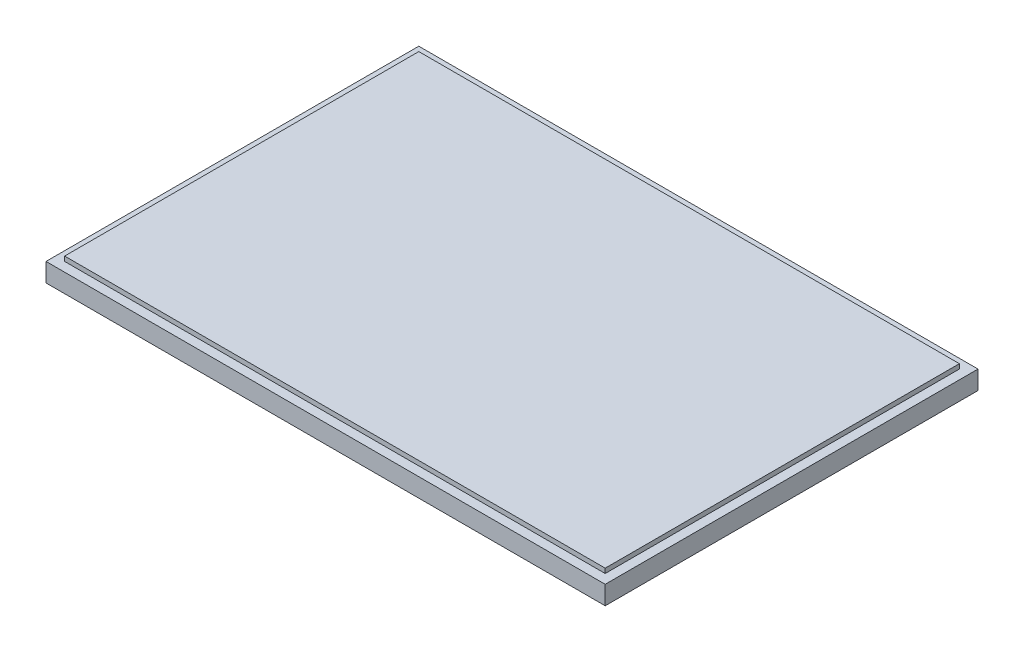
ISO-10303-21;
HEADER;
FILE_DESCRIPTION(('STEP AP214'),'2;1');
FILE_NAME('part.step','',(''),(''),'','','');
FILE_SCHEMA(('AUTOMOTIVE_DESIGN { 1 0 10303 214 1 1 1 1 }'));
ENDSEC;
DATA;
#1=APPLICATION_CONTEXT('core data for automotive mechanical design processes');
#2=APPLICATION_PROTOCOL_DEFINITION('international standard','automotive_design',2000,#1);
#3=PRODUCT_CONTEXT('',#1,'mechanical');
#4=PRODUCT('Part','Part','',(#3));
#5=PRODUCT_RELATED_PRODUCT_CATEGORY('part','',(#4));
#6=PRODUCT_DEFINITION_FORMATION('','',#4);
#7=PRODUCT_DEFINITION_CONTEXT('part definition',#1,'design');
#8=PRODUCT_DEFINITION('design','',#6,#7);
#9=PRODUCT_DEFINITION_SHAPE('','',#8);
#10=(LENGTH_UNIT() NAMED_UNIT(*) SI_UNIT(.MILLI.,.METRE.));
#11=(NAMED_UNIT(*) PLANE_ANGLE_UNIT() SI_UNIT($,.RADIAN.));
#12=(NAMED_UNIT(*) SI_UNIT($,.STERADIAN.) SOLID_ANGLE_UNIT());
#13=UNCERTAINTY_MEASURE_WITH_UNIT(LENGTH_MEASURE(1.E-05),#10,'distance_accuracy_value','');
#14=(GEOMETRIC_REPRESENTATION_CONTEXT(3) GLOBAL_UNCERTAINTY_ASSIGNED_CONTEXT((#13)) GLOBAL_UNIT_ASSIGNED_CONTEXT((#10,
#11,#12)) REPRESENTATION_CONTEXT('',''));
#15=CARTESIAN_POINT('',(0.,0.,0.));
#16=DIRECTION('',(0.,0.,1.));
#17=DIRECTION('',(1.,0.,0.));
#18=AXIS2_PLACEMENT_3D('',#15,#16,#17);
#19=CARTESIAN_POINT('',(30.,2.,-20.));
#20=DIRECTION('',(-1.,0.,0.));
#21=DIRECTION('',(0.,0.,1.));
#22=AXIS2_PLACEMENT_3D('',#19,#20,#21);
#23=PLANE('',#22);
#24=DIRECTION('',(0.,0.,-1.));
#25=VECTOR('',#24,1.);
#26=CARTESIAN_POINT('',(30.,0.,-20.));
#27=LINE('',#26,#25);
#28=CARTESIAN_POINT('',(30.,0.,20.));
#29=VERTEX_POINT('',#28);
#30=CARTESIAN_POINT('',(30.,0.,-20.));
#31=VERTEX_POINT('',#30);
#32=EDGE_CURVE('E133',#29,#31,#27,.T.);
#33=ORIENTED_EDGE('',*,*,#32,.T.);
#34=DIRECTION('',(0.,-1.,0.));
#35=VECTOR('',#34,1.);
#36=CARTESIAN_POINT('',(30.,2.,-20.));
#37=LINE('',#36,#35);
#38=CARTESIAN_POINT('',(30.,2.,-20.));
#39=VERTEX_POINT('',#38);
#40=EDGE_CURVE('E11',#39,#31,#37,.T.);
#41=ORIENTED_EDGE('',*,*,#40,.F.);
#42=DIRECTION('',(0.,0.,-1.));
#43=VECTOR('',#42,1.);
#44=CARTESIAN_POINT('',(30.,2.,-20.));
#45=LINE('',#44,#43);
#46=CARTESIAN_POINT('',(30.,2.,20.));
#47=VERTEX_POINT('',#46);
#48=EDGE_CURVE('E144',#47,#39,#45,.T.);
#49=ORIENTED_EDGE('',*,*,#48,.F.);
#50=DIRECTION('',(0.,-1.,0.));
#51=VECTOR('',#50,1.);
#52=CARTESIAN_POINT('',(30.,2.,20.));
#53=LINE('',#52,#51);
#54=EDGE_CURVE('E157',#47,#29,#53,.T.);
#55=ORIENTED_EDGE('',*,*,#54,.T.);
#56=EDGE_LOOP('',(#33,#41,#49,#55));
#57=FACE_BOUND('',#56,.T.);
#58=ADVANCED_FACE('F45',(#57),#23,.F.);
#59=CARTESIAN_POINT('',(-30.,2.,-20.));
#60=DIRECTION('',(0.,0.,1.));
#61=DIRECTION('',(1.,0.,0.));
#62=AXIS2_PLACEMENT_3D('',#59,#60,#61);
#63=PLANE('',#62);
#64=DIRECTION('',(-1.,0.,0.));
#65=VECTOR('',#64,1.);
#66=CARTESIAN_POINT('',(-30.,0.,-20.));
#67=LINE('',#66,#65);
#68=CARTESIAN_POINT('',(-30.,0.,-20.));
#69=VERTEX_POINT('',#68);
#70=EDGE_CURVE('E138',#31,#69,#67,.T.);
#71=ORIENTED_EDGE('',*,*,#70,.T.);
#72=DIRECTION('',(0.,-1.,0.));
#73=VECTOR('',#72,1.);
#74=CARTESIAN_POINT('',(-30.,2.,-20.));
#75=LINE('',#74,#73);
#76=CARTESIAN_POINT('',(-30.,2.,-20.));
#77=VERTEX_POINT('',#76);
#78=EDGE_CURVE('E53',#77,#69,#75,.T.);
#79=ORIENTED_EDGE('',*,*,#78,.F.);
#80=DIRECTION('',(-1.,0.,0.));
#81=VECTOR('',#80,1.);
#82=CARTESIAN_POINT('',(-30.,2.,-20.));
#83=LINE('',#82,#81);
#84=EDGE_CURVE('E148',#39,#77,#83,.T.);
#85=ORIENTED_EDGE('',*,*,#84,.F.);
#86=ORIENTED_EDGE('',*,*,#40,.T.);
#87=EDGE_LOOP('',(#71,#79,#85,#86));
#88=FACE_BOUND('',#87,.T.);
#89=ADVANCED_FACE('F194',(#88),#63,.F.);
#90=CARTESIAN_POINT('',(-30.,2.,-20.));
#91=DIRECTION('',(1.,0.,0.));
#92=DIRECTION('',(0.,0.,-1.));
#93=AXIS2_PLACEMENT_3D('',#90,#91,#92);
#94=PLANE('',#93);
#95=DIRECTION('',(0.,0.,1.));
#96=VECTOR('',#95,1.);
#97=CARTESIAN_POINT('',(-30.,0.,-20.));
#98=LINE('',#97,#96);
#99=CARTESIAN_POINT('',(-30.,0.,20.));
#100=VERTEX_POINT('',#99);
#101=EDGE_CURVE('E161',#69,#100,#98,.T.);
#102=ORIENTED_EDGE('',*,*,#101,.T.);
#103=DIRECTION('',(0.,-1.,0.));
#104=VECTOR('',#103,1.);
#105=CARTESIAN_POINT('',(-30.,2.,20.));
#106=LINE('',#105,#104);
#107=CARTESIAN_POINT('',(-30.,2.,20.));
#108=VERTEX_POINT('',#107);
#109=EDGE_CURVE('E169',#108,#100,#106,.T.);
#110=ORIENTED_EDGE('',*,*,#109,.F.);
#111=DIRECTION('',(0.,0.,1.));
#112=VECTOR('',#111,1.);
#113=CARTESIAN_POINT('',(-30.,2.,-20.));
#114=LINE('',#113,#112);
#115=EDGE_CURVE('E152',#77,#108,#114,.T.);
#116=ORIENTED_EDGE('',*,*,#115,.F.);
#117=ORIENTED_EDGE('',*,*,#78,.T.);
#118=EDGE_LOOP('',(#102,#110,#116,#117));
#119=FACE_BOUND('',#118,.T.);
#120=ADVANCED_FACE('F178',(#119),#94,.F.);
#121=CARTESIAN_POINT('',(-30.,2.,20.));
#122=DIRECTION('',(0.,0.,-1.));
#123=DIRECTION('',(-1.,0.,0.));
#124=AXIS2_PLACEMENT_3D('',#121,#122,#123);
#125=PLANE('',#124);
#126=DIRECTION('',(1.,0.,0.));
#127=VECTOR('',#126,1.);
#128=CARTESIAN_POINT('',(-30.,0.,20.));
#129=LINE('',#128,#127);
#130=EDGE_CURVE('E149',#100,#29,#129,.T.);
#131=ORIENTED_EDGE('',*,*,#130,.T.);
#132=ORIENTED_EDGE('',*,*,#54,.F.);
#133=DIRECTION('',(1.,0.,0.));
#134=VECTOR('',#133,1.);
#135=CARTESIAN_POINT('',(-30.,2.,20.));
#136=LINE('',#135,#134);
#137=EDGE_CURVE('E155',#108,#47,#136,.T.);
#138=ORIENTED_EDGE('',*,*,#137,.F.);
#139=ORIENTED_EDGE('',*,*,#109,.T.);
#140=EDGE_LOOP('',(#131,#132,#138,#139));
#141=FACE_BOUND('',#140,.T.);
#142=ADVANCED_FACE('F187',(#141),#125,.F.);
#143=CARTESIAN_POINT('',(0.,2.,0.));
#144=DIRECTION('',(0.,1.,0.));
#145=DIRECTION('',(0.,0.,1.));
#146=AXIS2_PLACEMENT_3D('',#143,#144,#145);
#147=PLANE('',#146);
#148=DIRECTION('',(0.,0.,-1.));
#149=VECTOR('',#148,1.);
#150=CARTESIAN_POINT('',(29.,2.,-19.));
#151=LINE('',#150,#149);
#152=CARTESIAN_POINT('',(29.,2.,19.));
#153=VERTEX_POINT('',#152);
#154=CARTESIAN_POINT('',(29.,2.,-19.));
#155=VERTEX_POINT('',#154);
#156=EDGE_CURVE('E60',#153,#155,#151,.T.);
#157=ORIENTED_EDGE('',*,*,#156,.F.);
#158=DIRECTION('',(1.,0.,0.));
#159=VECTOR('',#158,1.);
#160=CARTESIAN_POINT('',(-29.,2.,19.));
#161=LINE('',#160,#159);
#162=CARTESIAN_POINT('',(-29.,2.,19.));
#163=VERTEX_POINT('',#162);
#164=EDGE_CURVE('E64',#163,#153,#161,.T.);
#165=ORIENTED_EDGE('',*,*,#164,.F.);
#166=DIRECTION('',(0.,0.,1.));
#167=VECTOR('',#166,1.);
#168=CARTESIAN_POINT('',(-29.,2.,-19.));
#169=LINE('',#168,#167);
#170=CARTESIAN_POINT('',(-29.,2.,-19.));
#171=VERTEX_POINT('',#170);
#172=EDGE_CURVE('E289',#171,#163,#169,.T.);
#173=ORIENTED_EDGE('',*,*,#172,.F.);
#174=DIRECTION('',(-1.,0.,0.));
#175=VECTOR('',#174,1.);
#176=CARTESIAN_POINT('',(-29.,2.,-19.));
#177=LINE('',#176,#175);
#178=EDGE_CURVE('E299',#155,#171,#177,.T.);
#179=ORIENTED_EDGE('',*,*,#178,.F.);
#180=EDGE_LOOP('',(#157,#165,#173,#179));
#181=FACE_BOUND('',#180,.T.);
#182=ORIENTED_EDGE('',*,*,#48,.T.);
#183=ORIENTED_EDGE('',*,*,#84,.T.);
#184=ORIENTED_EDGE('',*,*,#115,.T.);
#185=ORIENTED_EDGE('',*,*,#137,.T.);
#186=EDGE_LOOP('',(#182,#183,#184,#185));
#187=FACE_BOUND('',#186,.T.);
#188=ADVANCED_FACE('F193',(#181,#187),#147,.T.);
#189=CARTESIAN_POINT('',(0.,0.,0.));
#190=DIRECTION('',(0.,1.,0.));
#191=DIRECTION('',(0.,0.,1.));
#192=AXIS2_PLACEMENT_3D('',#189,#190,#191);
#193=PLANE('',#192);
#194=ORIENTED_EDGE('',*,*,#32,.F.);
#195=ORIENTED_EDGE('',*,*,#130,.F.);
#196=ORIENTED_EDGE('',*,*,#101,.F.);
#197=ORIENTED_EDGE('',*,*,#70,.F.);
#198=EDGE_LOOP('',(#194,#195,#196,#197));
#199=FACE_BOUND('',#198,.T.);
#200=ADVANCED_FACE('F184',(#199),#193,.F.);
#201=CARTESIAN_POINT('',(29.,2.5,-19.));
#202=DIRECTION('',(-1.,0.,0.));
#203=DIRECTION('',(0.,0.,1.));
#204=AXIS2_PLACEMENT_3D('',#201,#202,#203);
#205=PLANE('',#204);
#206=ORIENTED_EDGE('',*,*,#156,.T.);
#207=DIRECTION('',(0.,-1.,0.));
#208=VECTOR('',#207,1.);
#209=CARTESIAN_POINT('',(29.,2.5,-19.));
#210=LINE('',#209,#208);
#211=CARTESIAN_POINT('',(29.,2.5,-19.));
#212=VERTEX_POINT('',#211);
#213=EDGE_CURVE('E113',#212,#155,#210,.T.);
#214=ORIENTED_EDGE('',*,*,#213,.F.);
#215=DIRECTION('',(0.,0.,-1.));
#216=VECTOR('',#215,1.);
#217=CARTESIAN_POINT('',(29.,2.5,-19.));
#218=LINE('',#217,#216);
#219=CARTESIAN_POINT('',(29.,2.5,19.));
#220=VERTEX_POINT('',#219);
#221=EDGE_CURVE('E120',#220,#212,#218,.T.);
#222=ORIENTED_EDGE('',*,*,#221,.F.);
#223=DIRECTION('',(0.,-1.,0.));
#224=VECTOR('',#223,1.);
#225=CARTESIAN_POINT('',(29.,2.5,19.));
#226=LINE('',#225,#224);
#227=EDGE_CURVE('E286',#220,#153,#226,.T.);
#228=ORIENTED_EDGE('',*,*,#227,.T.);
#229=EDGE_LOOP('',(#206,#214,#222,#228));
#230=FACE_BOUND('',#229,.T.);
#231=ADVANCED_FACE('F131',(#230),#205,.F.);
#232=CARTESIAN_POINT('',(-29.,2.5,-19.));
#233=DIRECTION('',(0.,0.,1.));
#234=DIRECTION('',(1.,0.,0.));
#235=AXIS2_PLACEMENT_3D('',#232,#233,#234);
#236=PLANE('',#235);
#237=ORIENTED_EDGE('',*,*,#178,.T.);
#238=DIRECTION('',(0.,-1.,0.));
#239=VECTOR('',#238,1.);
#240=CARTESIAN_POINT('',(-29.,2.5,-19.));
#241=LINE('',#240,#239);
#242=CARTESIAN_POINT('',(-29.,2.5,-19.));
#243=VERTEX_POINT('',#242);
#244=EDGE_CURVE('E115',#243,#171,#241,.T.);
#245=ORIENTED_EDGE('',*,*,#244,.F.);
#246=DIRECTION('',(-1.,0.,0.));
#247=VECTOR('',#246,1.);
#248=CARTESIAN_POINT('',(-29.,2.5,-19.));
#249=LINE('',#248,#247);
#250=EDGE_CURVE('E108',#212,#243,#249,.T.);
#251=ORIENTED_EDGE('',*,*,#250,.F.);
#252=ORIENTED_EDGE('',*,*,#213,.T.);
#253=EDGE_LOOP('',(#237,#245,#251,#252));
#254=FACE_BOUND('',#253,.T.);
#255=ADVANCED_FACE('F111',(#254),#236,.F.);
#256=CARTESIAN_POINT('',(-29.,2.5,-19.));
#257=DIRECTION('',(1.,0.,0.));
#258=DIRECTION('',(0.,0.,-1.));
#259=AXIS2_PLACEMENT_3D('',#256,#257,#258);
#260=PLANE('',#259);
#261=ORIENTED_EDGE('',*,*,#172,.T.);
#262=DIRECTION('',(0.,-1.,0.));
#263=VECTOR('',#262,1.);
#264=CARTESIAN_POINT('',(-29.,2.5,19.));
#265=LINE('',#264,#263);
#266=CARTESIAN_POINT('',(-29.,2.5,19.));
#267=VERTEX_POINT('',#266);
#268=EDGE_CURVE('E140',#267,#163,#265,.T.);
#269=ORIENTED_EDGE('',*,*,#268,.F.);
#270=DIRECTION('',(0.,0.,1.));
#271=VECTOR('',#270,1.);
#272=CARTESIAN_POINT('',(-29.,2.5,-19.));
#273=LINE('',#272,#271);
#274=EDGE_CURVE('E119',#243,#267,#273,.T.);
#275=ORIENTED_EDGE('',*,*,#274,.F.);
#276=ORIENTED_EDGE('',*,*,#244,.T.);
#277=EDGE_LOOP('',(#261,#269,#275,#276));
#278=FACE_BOUND('',#277,.T.);
#279=ADVANCED_FACE('F212',(#278),#260,.F.);
#280=CARTESIAN_POINT('',(-29.,2.5,19.));
#281=DIRECTION('',(0.,0.,-1.));
#282=DIRECTION('',(-1.,0.,0.));
#283=AXIS2_PLACEMENT_3D('',#280,#281,#282);
#284=PLANE('',#283);
#285=ORIENTED_EDGE('',*,*,#164,.T.);
#286=ORIENTED_EDGE('',*,*,#227,.F.);
#287=DIRECTION('',(1.,0.,0.));
#288=VECTOR('',#287,1.);
#289=CARTESIAN_POINT('',(-29.,2.5,19.));
#290=LINE('',#289,#288);
#291=EDGE_CURVE('E125',#267,#220,#290,.T.);
#292=ORIENTED_EDGE('',*,*,#291,.F.);
#293=ORIENTED_EDGE('',*,*,#268,.T.);
#294=EDGE_LOOP('',(#285,#286,#292,#293));
#295=FACE_BOUND('',#294,.T.);
#296=ADVANCED_FACE('F215',(#295),#284,.F.);
#297=CARTESIAN_POINT('',(0.,2.5,0.));
#298=DIRECTION('',(0.,1.,0.));
#299=DIRECTION('',(0.,0.,1.));
#300=AXIS2_PLACEMENT_3D('',#297,#298,#299);
#301=PLANE('',#300);
#302=ORIENTED_EDGE('',*,*,#221,.T.);
#303=ORIENTED_EDGE('',*,*,#250,.T.);
#304=ORIENTED_EDGE('',*,*,#274,.T.);
#305=ORIENTED_EDGE('',*,*,#291,.T.);
#306=EDGE_LOOP('',(#302,#303,#304,#305));
#307=FACE_BOUND('',#306,.T.);
#308=ADVANCED_FACE('F123',(#307),#301,.T.);
#309=CLOSED_SHELL('',(#58,#89,#120,#142,#188,#200,#231,#255,#279,#296,#308));
#310=MANIFOLD_SOLID_BREP('B2',#309);
#311=ADVANCED_BREP_SHAPE_REPRESENTATION('',(#18,#310),#14);
#312=SHAPE_DEFINITION_REPRESENTATION(#9,#311);
ENDSEC;
END-ISO-10303-21;
